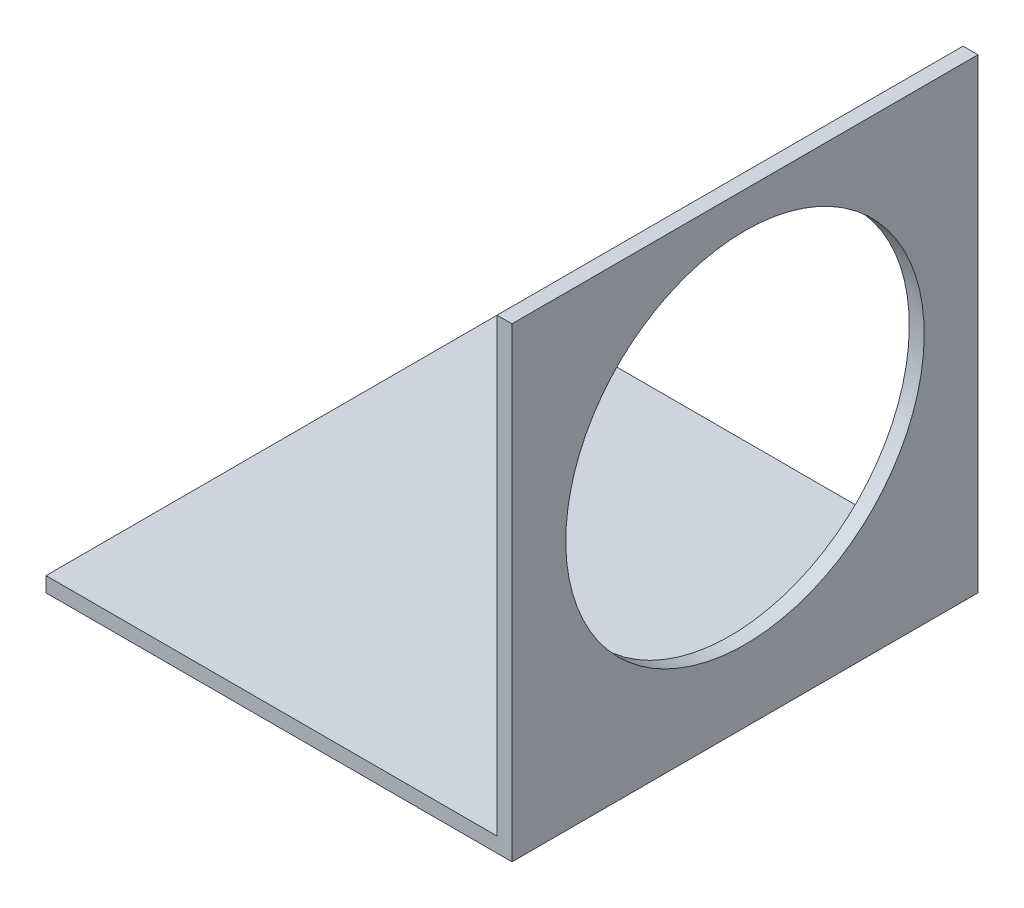
ISO-10303-21;
HEADER;
FILE_DESCRIPTION(('STEP AP214'),'2;1');
FILE_NAME('part.step','',(''),(''),'','','');
FILE_SCHEMA(('AUTOMOTIVE_DESIGN { 1 0 10303 214 1 1 1 1 }'));
ENDSEC;
DATA;
#1=APPLICATION_CONTEXT('core data for automotive mechanical design processes');
#2=APPLICATION_PROTOCOL_DEFINITION('international standard','automotive_design',2000,#1);
#3=PRODUCT_CONTEXT('',#1,'mechanical');
#4=PRODUCT('Part','Part','',(#3));
#5=PRODUCT_RELATED_PRODUCT_CATEGORY('part','',(#4));
#6=PRODUCT_DEFINITION_FORMATION('','',#4);
#7=PRODUCT_DEFINITION_CONTEXT('part definition',#1,'design');
#8=PRODUCT_DEFINITION('design','',#6,#7);
#9=PRODUCT_DEFINITION_SHAPE('','',#8);
#10=(LENGTH_UNIT() NAMED_UNIT(*) SI_UNIT(.MILLI.,.METRE.));
#11=(NAMED_UNIT(*) PLANE_ANGLE_UNIT() SI_UNIT($,.RADIAN.));
#12=(NAMED_UNIT(*) SI_UNIT($,.STERADIAN.) SOLID_ANGLE_UNIT());
#13=UNCERTAINTY_MEASURE_WITH_UNIT(LENGTH_MEASURE(1.E-05),#10,'distance_accuracy_value','');
#14=(GEOMETRIC_REPRESENTATION_CONTEXT(3) GLOBAL_UNCERTAINTY_ASSIGNED_CONTEXT((#13)) GLOBAL_UNIT_ASSIGNED_CONTEXT((#10,
#11,#12)) REPRESENTATION_CONTEXT('',''));
#15=CARTESIAN_POINT('',(0.,0.,0.));
#16=DIRECTION('',(0.,0.,1.));
#17=DIRECTION('',(1.,0.,0.));
#18=AXIS2_PLACEMENT_3D('',#15,#16,#17);
#19=CARTESIAN_POINT('',(0.,95.885,99.06));
#20=DIRECTION('',(1.,0.,0.));
#21=DIRECTION('',(0.,1.,0.));
#22=AXIS2_PLACEMENT_3D('',#19,#20,#21);
#23=PLANE('',#22);
#24=CARTESIAN_POINT('',(0.,50.165,49.53));
#25=DIRECTION('',(1.,0.,0.));
#26=DIRECTION('',(0.,1.,0.));
#27=AXIS2_PLACEMENT_3D('',#24,#25,#26);
#28=CIRCLE('',#27,38.1);
#29=CARTESIAN_POINT('',(0.,88.265,49.53));
#30=VERTEX_POINT('',#29);
#31=EDGE_CURVE('E125',#30,#30,#28,.T.);
#32=ORIENTED_EDGE('',*,*,#31,.T.);
#33=EDGE_LOOP('',(#32));
#34=FACE_BOUND('',#33,.T.);
#35=DIRECTION('',(0.,-1.,0.));
#36=VECTOR('',#35,1.);
#37=CARTESIAN_POINT('',(0.,95.885,0.));
#38=LINE('',#37,#36);
#39=CARTESIAN_POINT('',(0.,95.885,0.));
#40=VERTEX_POINT('',#39);
#41=CARTESIAN_POINT('',(0.,0.,0.));
#42=VERTEX_POINT('',#41);
#43=EDGE_CURVE('E121',#40,#42,#38,.T.);
#44=ORIENTED_EDGE('',*,*,#43,.T.);
#45=DIRECTION('',(0.,0.,-1.));
#46=VECTOR('',#45,1.);
#47=CARTESIAN_POINT('',(0.,0.,99.06));
#48=LINE('',#47,#46);
#49=CARTESIAN_POINT('',(0.,0.,99.06));
#50=VERTEX_POINT('',#49);
#51=EDGE_CURVE('E11',#50,#42,#48,.T.);
#52=ORIENTED_EDGE('',*,*,#51,.F.);
#53=DIRECTION('',(0.,-1.,0.));
#54=VECTOR('',#53,1.);
#55=CARTESIAN_POINT('',(0.,95.885,99.06));
#56=LINE('',#55,#54);
#57=CARTESIAN_POINT('',(0.,95.885,99.06));
#58=VERTEX_POINT('',#57);
#59=EDGE_CURVE('E132',#58,#50,#56,.T.);
#60=ORIENTED_EDGE('',*,*,#59,.F.);
#61=DIRECTION('',(0.,0.,-1.));
#62=VECTOR('',#61,1.);
#63=CARTESIAN_POINT('',(0.,95.885,99.06));
#64=LINE('',#63,#62);
#65=EDGE_CURVE('E117',#58,#40,#64,.T.);
#66=ORIENTED_EDGE('',*,*,#65,.T.);
#67=EDGE_LOOP('',(#44,#52,#60,#66));
#68=FACE_BOUND('',#67,.T.);
#69=ADVANCED_FACE('F37',(#34,#68),#23,.F.);
#70=CARTESIAN_POINT('',(0.,0.,99.06));
#71=DIRECTION('',(0.,-1.,0.));
#72=DIRECTION('',(1.,0.,0.));
#73=AXIS2_PLACEMENT_3D('',#70,#71,#72);
#74=PLANE('',#73);
#75=DIRECTION('',(-1.,0.,0.));
#76=VECTOR('',#75,1.);
#77=CARTESIAN_POINT('',(0.,0.,0.));
#78=LINE('',#77,#76);
#79=CARTESIAN_POINT('',(-95.885,0.,0.));
#80=VERTEX_POINT('',#79);
#81=EDGE_CURVE('E124',#42,#80,#78,.T.);
#82=ORIENTED_EDGE('',*,*,#81,.T.);
#83=DIRECTION('',(0.,0.,-1.));
#84=VECTOR('',#83,1.);
#85=CARTESIAN_POINT('',(-95.885,0.,99.06));
#86=LINE('',#85,#84);
#87=CARTESIAN_POINT('',(-95.885,0.,99.06));
#88=VERTEX_POINT('',#87);
#89=EDGE_CURVE('E45',#88,#80,#86,.T.);
#90=ORIENTED_EDGE('',*,*,#89,.F.);
#91=DIRECTION('',(-1.,0.,0.));
#92=VECTOR('',#91,1.);
#93=CARTESIAN_POINT('',(0.,0.,99.06));
#94=LINE('',#93,#92);
#95=EDGE_CURVE('E90',#50,#88,#94,.T.);
#96=ORIENTED_EDGE('',*,*,#95,.F.);
#97=ORIENTED_EDGE('',*,*,#51,.T.);
#98=EDGE_LOOP('',(#82,#90,#96,#97));
#99=FACE_BOUND('',#98,.T.);
#100=ADVANCED_FACE('F157',(#99),#74,.F.);
#101=CARTESIAN_POINT('',(-95.885,0.,99.06));
#102=DIRECTION('',(1.,0.,0.));
#103=DIRECTION('',(0.,0.,-1.));
#104=AXIS2_PLACEMENT_3D('',#101,#102,#103);
#105=PLANE('',#104);
#106=DIRECTION('',(0.,-1.,0.));
#107=VECTOR('',#106,1.);
#108=CARTESIAN_POINT('',(-95.885,0.,0.));
#109=LINE('',#108,#107);
#110=CARTESIAN_POINT('',(-95.885,-3.17500000000001,0.));
#111=VERTEX_POINT('',#110);
#112=EDGE_CURVE('E127',#80,#111,#109,.T.);
#113=ORIENTED_EDGE('',*,*,#112,.T.);
#114=DIRECTION('',(0.,0.,-1.));
#115=VECTOR('',#114,1.);
#116=CARTESIAN_POINT('',(-95.885,-3.17500000000001,99.06));
#117=LINE('',#116,#115);
#118=CARTESIAN_POINT('',(-95.885,-3.17500000000001,99.06));
#119=VERTEX_POINT('',#118);
#120=EDGE_CURVE('E112',#119,#111,#117,.T.);
#121=ORIENTED_EDGE('',*,*,#120,.F.);
#122=DIRECTION('',(0.,-1.,0.));
#123=VECTOR('',#122,1.);
#124=CARTESIAN_POINT('',(-95.885,0.,99.06));
#125=LINE('',#124,#123);
#126=EDGE_CURVE('E103',#88,#119,#125,.T.);
#127=ORIENTED_EDGE('',*,*,#126,.F.);
#128=ORIENTED_EDGE('',*,*,#89,.T.);
#129=EDGE_LOOP('',(#113,#121,#127,#128));
#130=FACE_BOUND('',#129,.T.);
#131=ADVANCED_FACE('F138',(#130),#105,.F.);
#132=CARTESIAN_POINT('',(-95.885,-3.17500000000001,99.06));
#133=DIRECTION('',(0.,1.,0.));
#134=DIRECTION('',(-1.,0.,0.));
#135=AXIS2_PLACEMENT_3D('',#132,#133,#134);
#136=PLANE('',#135);
#137=DIRECTION('',(1.,0.,0.));
#138=VECTOR('',#137,1.);
#139=CARTESIAN_POINT('',(-95.885,-3.17500000000001,0.));
#140=LINE('',#139,#138);
#141=CARTESIAN_POINT('',(3.175,-3.17500000000001,0.));
#142=VERTEX_POINT('',#141);
#143=EDGE_CURVE('E111',#111,#142,#140,.T.);
#144=ORIENTED_EDGE('',*,*,#143,.T.);
#145=DIRECTION('',(0.,0.,-1.));
#146=VECTOR('',#145,1.);
#147=CARTESIAN_POINT('',(3.175,-3.17500000000001,99.06));
#148=LINE('',#147,#146);
#149=CARTESIAN_POINT('',(3.175,-3.17500000000001,99.06));
#150=VERTEX_POINT('',#149);
#151=EDGE_CURVE('E108',#150,#142,#148,.T.);
#152=ORIENTED_EDGE('',*,*,#151,.F.);
#153=DIRECTION('',(1.,0.,0.));
#154=VECTOR('',#153,1.);
#155=CARTESIAN_POINT('',(-95.885,-3.17500000000001,99.06));
#156=LINE('',#155,#154);
#157=EDGE_CURVE('E97',#119,#150,#156,.T.);
#158=ORIENTED_EDGE('',*,*,#157,.F.);
#159=ORIENTED_EDGE('',*,*,#120,.T.);
#160=EDGE_LOOP('',(#144,#152,#158,#159));
#161=FACE_BOUND('',#160,.T.);
#162=ADVANCED_FACE('F109',(#161),#136,.F.);
#163=CARTESIAN_POINT('',(3.175,-3.17500000000001,99.06));
#164=DIRECTION('',(-1.,0.,0.));
#165=DIRECTION('',(0.,-1.,0.));
#166=AXIS2_PLACEMENT_3D('',#163,#164,#165);
#167=PLANE('',#166);
#168=CARTESIAN_POINT('',(3.17500000000001,50.165,49.53));
#169=DIRECTION('',(1.,0.,0.));
#170=DIRECTION('',(0.,1.,0.));
#171=AXIS2_PLACEMENT_3D('',#168,#169,#170);
#172=CIRCLE('',#171,38.1);
#173=CARTESIAN_POINT('',(3.17500000000001,88.265,49.53));
#174=VERTEX_POINT('',#173);
#175=EDGE_CURVE('E165',#174,#174,#172,.T.);
#176=ORIENTED_EDGE('',*,*,#175,.F.);
#177=EDGE_LOOP('',(#176));
#178=FACE_BOUND('',#177,.T.);
#179=DIRECTION('',(0.,1.,0.));
#180=VECTOR('',#179,1.);
#181=CARTESIAN_POINT('',(3.175,-3.17500000000001,0.));
#182=LINE('',#181,#180);
#183=CARTESIAN_POINT('',(3.17500000000001,95.885,0.));
#184=VERTEX_POINT('',#183);
#185=EDGE_CURVE('E76',#142,#184,#182,.T.);
#186=ORIENTED_EDGE('',*,*,#185,.T.);
#187=DIRECTION('',(0.,0.,-1.));
#188=VECTOR('',#187,1.);
#189=CARTESIAN_POINT('',(3.17500000000001,95.885,99.06));
#190=LINE('',#189,#188);
#191=CARTESIAN_POINT('',(3.17500000000001,95.885,99.06));
#192=VERTEX_POINT('',#191);
#193=EDGE_CURVE('E113',#192,#184,#190,.T.);
#194=ORIENTED_EDGE('',*,*,#193,.F.);
#195=DIRECTION('',(0.,1.,0.));
#196=VECTOR('',#195,1.);
#197=CARTESIAN_POINT('',(3.175,-3.17500000000001,99.06));
#198=LINE('',#197,#196);
#199=EDGE_CURVE('E101',#150,#192,#198,.T.);
#200=ORIENTED_EDGE('',*,*,#199,.F.);
#201=ORIENTED_EDGE('',*,*,#151,.T.);
#202=EDGE_LOOP('',(#186,#194,#200,#201));
#203=FACE_BOUND('',#202,.T.);
#204=ADVANCED_FACE('F115',(#178,#203),#167,.F.);
#205=CARTESIAN_POINT('',(3.17500000000001,95.885,99.06));
#206=DIRECTION('',(0.,-1.,0.));
#207=DIRECTION('',(0.,0.,-1.));
#208=AXIS2_PLACEMENT_3D('',#205,#206,#207);
#209=PLANE('',#208);
#210=DIRECTION('',(-1.,0.,0.));
#211=VECTOR('',#210,1.);
#212=CARTESIAN_POINT('',(3.17500000000001,95.885,0.));
#213=LINE('',#212,#211);
#214=EDGE_CURVE('E82',#184,#40,#213,.T.);
#215=ORIENTED_EDGE('',*,*,#214,.T.);
#216=ORIENTED_EDGE('',*,*,#65,.F.);
#217=DIRECTION('',(-1.,0.,0.));
#218=VECTOR('',#217,1.);
#219=CARTESIAN_POINT('',(3.17500000000001,95.885,99.06));
#220=LINE('',#219,#218);
#221=EDGE_CURVE('E53',#192,#58,#220,.T.);
#222=ORIENTED_EDGE('',*,*,#221,.F.);
#223=ORIENTED_EDGE('',*,*,#193,.T.);
#224=EDGE_LOOP('',(#215,#216,#222,#223));
#225=FACE_BOUND('',#224,.T.);
#226=ADVANCED_FACE('F145',(#225),#209,.F.);
#227=CARTESIAN_POINT('',(0.,0.,99.06));
#228=DIRECTION('',(0.,0.,-1.));
#229=DIRECTION('',(-1.,0.,0.));
#230=AXIS2_PLACEMENT_3D('',#227,#228,#229);
#231=PLANE('',#230);
#232=ORIENTED_EDGE('',*,*,#59,.T.);
#233=ORIENTED_EDGE('',*,*,#95,.T.);
#234=ORIENTED_EDGE('',*,*,#126,.T.);
#235=ORIENTED_EDGE('',*,*,#157,.T.);
#236=ORIENTED_EDGE('',*,*,#199,.T.);
#237=ORIENTED_EDGE('',*,*,#221,.T.);
#238=EDGE_LOOP('',(#232,#233,#234,#235,#236,#237));
#239=FACE_BOUND('',#238,.T.);
#240=ADVANCED_FACE('F99',(#239),#231,.F.);
#241=CARTESIAN_POINT('',(0.,0.,0.));
#242=DIRECTION('',(0.,0.,-1.));
#243=DIRECTION('',(-1.,0.,0.));
#244=AXIS2_PLACEMENT_3D('',#241,#242,#243);
#245=PLANE('',#244);
#246=ORIENTED_EDGE('',*,*,#43,.F.);
#247=ORIENTED_EDGE('',*,*,#214,.F.);
#248=ORIENTED_EDGE('',*,*,#185,.F.);
#249=ORIENTED_EDGE('',*,*,#143,.F.);
#250=ORIENTED_EDGE('',*,*,#112,.F.);
#251=ORIENTED_EDGE('',*,*,#81,.F.);
#252=EDGE_LOOP('',(#246,#247,#248,#249,#250,#251));
#253=FACE_BOUND('',#252,.T.);
#254=ADVANCED_FACE('F141',(#253),#245,.T.);
#255=CARTESIAN_POINT('',(-95.885,50.165,49.53));
#256=DIRECTION('',(1.,0.,0.));
#257=DIRECTION('',(0.,1.,0.));
#258=AXIS2_PLACEMENT_3D('',#255,#256,#257);
#259=CYLINDRICAL_SURFACE('',#258,38.1);
#260=ORIENTED_EDGE('',*,*,#175,.T.);
#261=EDGE_LOOP('',(#260));
#262=FACE_BOUND('',#261,.T.);
#263=ORIENTED_EDGE('',*,*,#31,.F.);
#264=EDGE_LOOP('',(#263));
#265=FACE_BOUND('',#264,.T.);
#266=ADVANCED_FACE('F173',(#262,#265),#259,.F.);
#267=CLOSED_SHELL('',(#69,#100,#131,#162,#204,#226,#240,#254,#266));
#268=MANIFOLD_SOLID_BREP('B2',#267);
#269=ADVANCED_BREP_SHAPE_REPRESENTATION('',(#18,#268),#14);
#270=SHAPE_DEFINITION_REPRESENTATION(#9,#269);
ENDSEC;
END-ISO-10303-21;
